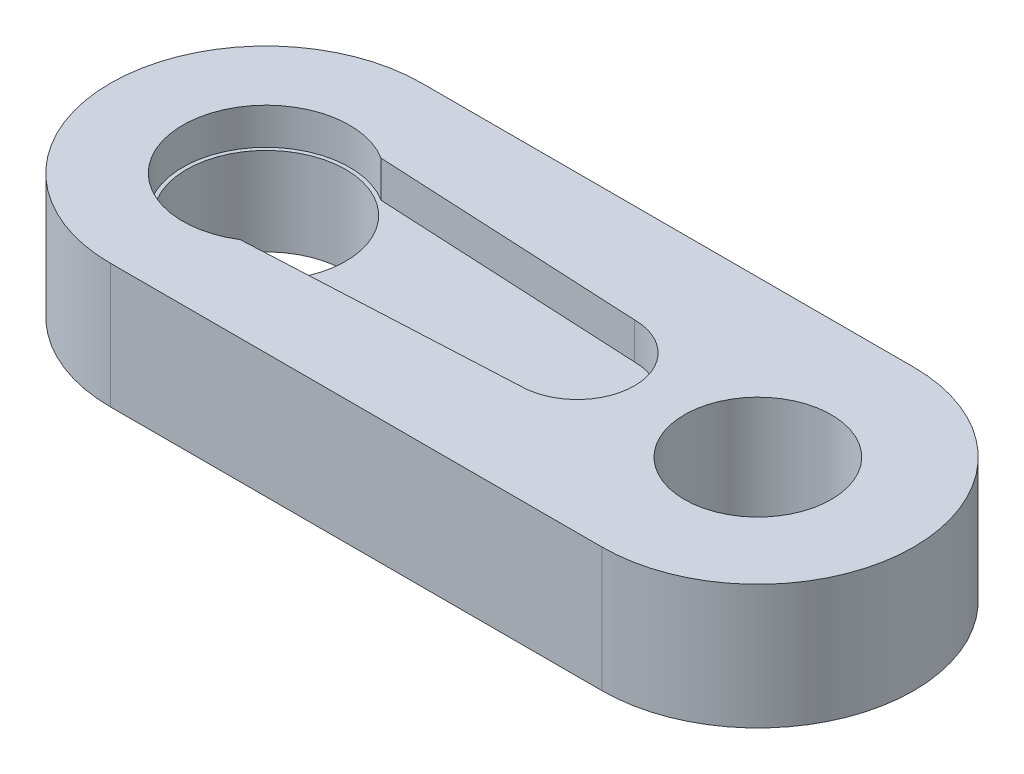
ISO-10303-21;
HEADER;
FILE_DESCRIPTION(('STEP AP214'),'2;1');
FILE_NAME('part.step','',(''),(''),'','','');
FILE_SCHEMA(('AUTOMOTIVE_DESIGN { 1 0 10303 214 1 1 1 1 }'));
ENDSEC;
DATA;
#1=APPLICATION_CONTEXT('core data for automotive mechanical design processes');
#2=APPLICATION_PROTOCOL_DEFINITION('international standard','automotive_design',2000,#1);
#3=PRODUCT_CONTEXT('',#1,'mechanical');
#4=PRODUCT('Part','Part','',(#3));
#5=PRODUCT_RELATED_PRODUCT_CATEGORY('part','',(#4));
#6=PRODUCT_DEFINITION_FORMATION('','',#4);
#7=PRODUCT_DEFINITION_CONTEXT('part definition',#1,'design');
#8=PRODUCT_DEFINITION('design','',#6,#7);
#9=PRODUCT_DEFINITION_SHAPE('','',#8);
#10=(LENGTH_UNIT() NAMED_UNIT(*) SI_UNIT(.MILLI.,.METRE.));
#11=(NAMED_UNIT(*) PLANE_ANGLE_UNIT() SI_UNIT($,.RADIAN.));
#12=(NAMED_UNIT(*) SI_UNIT($,.STERADIAN.) SOLID_ANGLE_UNIT());
#13=UNCERTAINTY_MEASURE_WITH_UNIT(LENGTH_MEASURE(1.E-05),#10,'distance_accuracy_value','');
#14=(GEOMETRIC_REPRESENTATION_CONTEXT(3) GLOBAL_UNCERTAINTY_ASSIGNED_CONTEXT((#13)) GLOBAL_UNIT_ASSIGNED_CONTEXT((#10,
#11,#12)) REPRESENTATION_CONTEXT('',''));
#15=CARTESIAN_POINT('',(0.,0.,0.));
#16=DIRECTION('',(0.,0.,1.));
#17=DIRECTION('',(1.,0.,0.));
#18=AXIS2_PLACEMENT_3D('',#15,#16,#17);
#19=CARTESIAN_POINT('',(0.,3.95,0.));
#20=DIRECTION('',(0.,1.,0.));
#21=DIRECTION('',(0.,0.,1.));
#22=AXIS2_PLACEMENT_3D('',#19,#20,#21);
#23=PLANE('',#22);
#24=CARTESIAN_POINT('',(0.,3.95,0.));
#25=DIRECTION('',(0.,-1.,0.));
#26=DIRECTION('',(0.,0.,-1.));
#27=AXIS2_PLACEMENT_3D('',#24,#25,#26);
#28=CIRCLE('',#27,3.575);
#29=CARTESIAN_POINT('',(0.,3.95,-3.575));
#30=VERTEX_POINT('',#29);
#31=EDGE_CURVE('E177',#30,#30,#28,.T.);
#32=ORIENTED_EDGE('',*,*,#31,.T.);
#33=EDGE_LOOP('',(#32));
#34=FACE_BOUND('',#33,.T.);
#35=DIRECTION('',(0.99875866941023,0.,-0.0498108449828537));
#36=VECTOR('',#35,1.);
#37=CARTESIAN_POINT('',(1.99792628223678,3.95,3.16754093434442));
#38=LINE('',#37,#36);
#39=CARTESIAN_POINT('',(1.99792628223678,3.95,3.16754093434442));
#40=VERTEX_POINT('',#39);
#41=CARTESIAN_POINT('',(13.9793089820932,3.95,2.5699963876771));
#42=VERTEX_POINT('',#41);
#43=EDGE_CURVE('E117',#40,#42,#38,.T.);
#44=ORIENTED_EDGE('',*,*,#43,.T.);
#45=CARTESIAN_POINT('',(13.975,3.95,0.));
#46=DIRECTION('',(0.,1.,0.));
#47=DIRECTION('',(0.,0.,1.));
#48=AXIS2_PLACEMENT_3D('',#45,#46,#47);
#49=CIRCLE('',#48,2.57);
#50=CARTESIAN_POINT('',(13.9793089820932,3.95,-2.5699963876771));
#51=VERTEX_POINT('',#50);
#52=EDGE_CURVE('E141',#42,#51,#49,.T.);
#53=ORIENTED_EDGE('',*,*,#52,.T.);
#54=DIRECTION('',(-0.99875866941023,0.,-0.0498108449828539));
#55=VECTOR('',#54,1.);
#56=CARTESIAN_POINT('',(13.9793089820932,3.95,-2.5699963876771));
#57=LINE('',#56,#55);
#58=CARTESIAN_POINT('',(1.99792628223678,3.95,-3.16754093434442));
#59=VERTEX_POINT('',#58);
#60=EDGE_CURVE('E123',#51,#59,#57,.T.);
#61=ORIENTED_EDGE('',*,*,#60,.T.);
#62=CARTESIAN_POINT('',(0.,3.95,0.));
#63=DIRECTION('',(0.,1.,0.));
#64=DIRECTION('',(0.,0.,-1.));
#65=AXIS2_PLACEMENT_3D('',#62,#63,#64);
#66=CIRCLE('',#65,3.745);
#67=EDGE_CURVE('E147',#59,#40,#66,.T.);
#68=ORIENTED_EDGE('',*,*,#67,.T.);
#69=EDGE_LOOP('',(#44,#53,#61,#68));
#70=FACE_BOUND('',#69,.T.);
#71=ADVANCED_FACE('F39',(#34,#70),#23,.T.);
#72=CARTESIAN_POINT('',(0.,3.95,0.));
#73=DIRECTION('',(0.,-1.,0.));
#74=DIRECTION('',(0.,0.,-1.));
#75=AXIS2_PLACEMENT_3D('',#72,#73,#74);
#76=CYLINDRICAL_SURFACE('',#75,7.);
#77=CARTESIAN_POINT('',(0.,0.,0.));
#78=DIRECTION('',(0.,1.,0.));
#79=DIRECTION('',(0.,0.,1.));
#80=AXIS2_PLACEMENT_3D('',#77,#78,#79);
#81=CIRCLE('',#80,7.);
#82=CARTESIAN_POINT('',(0.,0.,-7.));
#83=VERTEX_POINT('',#82);
#84=CARTESIAN_POINT('',(0.,0.,7.));
#85=VERTEX_POINT('',#84);
#86=EDGE_CURVE('E181',#83,#85,#81,.T.);
#87=ORIENTED_EDGE('',*,*,#86,.T.);
#88=DIRECTION('',(0.,-1.,0.));
#89=VECTOR('',#88,1.);
#90=CARTESIAN_POINT('',(0.,3.95,7.));
#91=LINE('',#90,#89);
#92=CARTESIAN_POINT('',(0.,5.59,7.));
#93=VERTEX_POINT('',#92);
#94=EDGE_CURVE('E11',#93,#85,#91,.T.);
#95=ORIENTED_EDGE('',*,*,#94,.F.);
#96=CARTESIAN_POINT('',(0.,5.59,0.));
#97=DIRECTION('',(0.,1.,0.));
#98=DIRECTION('',(0.,0.,1.));
#99=AXIS2_PLACEMENT_3D('',#96,#97,#98);
#100=CIRCLE('',#99,7.);
#101=CARTESIAN_POINT('',(0.,5.59,-7.));
#102=VERTEX_POINT('',#101);
#103=EDGE_CURVE('E125',#102,#93,#100,.T.);
#104=ORIENTED_EDGE('',*,*,#103,.F.);
#105=DIRECTION('',(0.,-1.,0.));
#106=VECTOR('',#105,1.);
#107=CARTESIAN_POINT('',(0.,3.95,-7.));
#108=LINE('',#107,#106);
#109=EDGE_CURVE('E196',#102,#83,#108,.T.);
#110=ORIENTED_EDGE('',*,*,#109,.T.);
#111=EDGE_LOOP('',(#87,#95,#104,#110));
#112=FACE_BOUND('',#111,.T.);
#113=ADVANCED_FACE('F41',(#112),#76,.T.);
#114=CARTESIAN_POINT('',(0.,3.95,7.));
#115=DIRECTION('',(0.,0.,-1.));
#116=DIRECTION('',(-1.,0.,0.));
#117=AXIS2_PLACEMENT_3D('',#114,#115,#116);
#118=PLANE('',#117);
#119=DIRECTION('',(1.,0.,0.));
#120=VECTOR('',#119,1.);
#121=CARTESIAN_POINT('',(0.,0.,7.));
#122=LINE('',#121,#120);
#123=CARTESIAN_POINT('',(22.0896226415094,0.,7.));
#124=VERTEX_POINT('',#123);
#125=EDGE_CURVE('E188',#85,#124,#122,.T.);
#126=ORIENTED_EDGE('',*,*,#125,.T.);
#127=DIRECTION('',(0.,-1.,0.));
#128=VECTOR('',#127,1.);
#129=CARTESIAN_POINT('',(22.0896226415094,3.95,7.));
#130=LINE('',#129,#128);
#131=CARTESIAN_POINT('',(22.0896226415094,5.59,7.));
#132=VERTEX_POINT('',#131);
#133=EDGE_CURVE('E48',#132,#124,#130,.T.);
#134=ORIENTED_EDGE('',*,*,#133,.F.);
#135=DIRECTION('',(1.,0.,0.));
#136=VECTOR('',#135,1.);
#137=CARTESIAN_POINT('',(0.,5.59,7.));
#138=LINE('',#137,#136);
#139=EDGE_CURVE('E164',#93,#132,#138,.T.);
#140=ORIENTED_EDGE('',*,*,#139,.F.);
#141=ORIENTED_EDGE('',*,*,#94,.T.);
#142=EDGE_LOOP('',(#126,#134,#140,#141));
#143=FACE_BOUND('',#142,.T.);
#144=ADVANCED_FACE('F217',(#143),#118,.F.);
#145=CARTESIAN_POINT('',(22.0896226415094,3.95,0.));
#146=DIRECTION('',(0.,-1.,0.));
#147=DIRECTION('',(0.,0.,-1.));
#148=AXIS2_PLACEMENT_3D('',#145,#146,#147);
#149=CYLINDRICAL_SURFACE('',#148,7.);
#150=CARTESIAN_POINT('',(22.0896226415094,0.,0.));
#151=DIRECTION('',(0.,1.,0.));
#152=DIRECTION('',(0.,0.,1.));
#153=AXIS2_PLACEMENT_3D('',#150,#151,#152);
#154=CIRCLE('',#153,7.);
#155=CARTESIAN_POINT('',(22.0896226415094,0.,-7.));
#156=VERTEX_POINT('',#155);
#157=EDGE_CURVE('E191',#124,#156,#154,.T.);
#158=ORIENTED_EDGE('',*,*,#157,.T.);
#159=DIRECTION('',(0.,-1.,0.));
#160=VECTOR('',#159,1.);
#161=CARTESIAN_POINT('',(22.0896226415094,3.95,-7.));
#162=LINE('',#161,#160);
#163=CARTESIAN_POINT('',(22.0896226415094,5.59,-7.));
#164=VERTEX_POINT('',#163);
#165=EDGE_CURVE('E199',#164,#156,#162,.T.);
#166=ORIENTED_EDGE('',*,*,#165,.F.);
#167=CARTESIAN_POINT('',(22.0896226415094,5.59,0.));
#168=DIRECTION('',(0.,1.,0.));
#169=DIRECTION('',(0.,0.,1.));
#170=AXIS2_PLACEMENT_3D('',#167,#168,#169);
#171=CIRCLE('',#170,7.);
#172=EDGE_CURVE('E168',#132,#164,#171,.T.);
#173=ORIENTED_EDGE('',*,*,#172,.F.);
#174=ORIENTED_EDGE('',*,*,#133,.T.);
#175=EDGE_LOOP('',(#158,#166,#173,#174));
#176=FACE_BOUND('',#175,.T.);
#177=ADVANCED_FACE('F206',(#176),#149,.T.);
#178=CARTESIAN_POINT('',(0.,3.95,-7.));
#179=DIRECTION('',(0.,0.,1.));
#180=DIRECTION('',(1.,0.,0.));
#181=AXIS2_PLACEMENT_3D('',#178,#179,#180);
#182=PLANE('',#181);
#183=DIRECTION('',(-1.,0.,0.));
#184=VECTOR('',#183,1.);
#185=CARTESIAN_POINT('',(0.,0.,-7.));
#186=LINE('',#185,#184);
#187=EDGE_CURVE('E63',#156,#83,#186,.T.);
#188=ORIENTED_EDGE('',*,*,#187,.T.);
#189=ORIENTED_EDGE('',*,*,#109,.F.);
#190=DIRECTION('',(-1.,0.,0.));
#191=VECTOR('',#190,1.);
#192=CARTESIAN_POINT('',(22.0896226415094,5.59,-7.));
#193=LINE('',#192,#191);
#194=EDGE_CURVE('E172',#164,#102,#193,.T.);
#195=ORIENTED_EDGE('',*,*,#194,.F.);
#196=ORIENTED_EDGE('',*,*,#165,.T.);
#197=EDGE_LOOP('',(#188,#189,#195,#196));
#198=FACE_BOUND('',#197,.T.);
#199=ADVANCED_FACE('F215',(#198),#182,.F.);
#200=CARTESIAN_POINT('',(0.,0.,0.));
#201=DIRECTION('',(0.,1.,0.));
#202=DIRECTION('',(0.,0.,1.));
#203=AXIS2_PLACEMENT_3D('',#200,#201,#202);
#204=PLANE('',#203);
#205=CARTESIAN_POINT('',(22.0896226415094,0.,0.));
#206=DIRECTION('',(0.,1.,0.));
#207=DIRECTION('',(0.,0.,1.));
#208=AXIS2_PLACEMENT_3D('',#205,#206,#207);
#209=CIRCLE('',#208,3.3);
#210=CARTESIAN_POINT('',(22.0896226415094,0.,3.3));
#211=VERTEX_POINT('',#210);
#212=EDGE_CURVE('E144',#211,#211,#209,.T.);
#213=ORIENTED_EDGE('',*,*,#212,.T.);
#214=EDGE_LOOP('',(#213));
#215=FACE_BOUND('',#214,.T.);
#216=CARTESIAN_POINT('',(0.,0.,0.));
#217=DIRECTION('',(0.,-1.,0.));
#218=DIRECTION('',(0.,0.,-1.));
#219=AXIS2_PLACEMENT_3D('',#216,#217,#218);
#220=CIRCLE('',#219,3.575);
#221=CARTESIAN_POINT('',(0.,0.,-3.575));
#222=VERTEX_POINT('',#221);
#223=EDGE_CURVE('E176',#222,#222,#220,.T.);
#224=ORIENTED_EDGE('',*,*,#223,.F.);
#225=EDGE_LOOP('',(#224));
#226=FACE_BOUND('',#225,.T.);
#227=ORIENTED_EDGE('',*,*,#86,.F.);
#228=ORIENTED_EDGE('',*,*,#187,.F.);
#229=ORIENTED_EDGE('',*,*,#157,.F.);
#230=ORIENTED_EDGE('',*,*,#125,.F.);
#231=EDGE_LOOP('',(#227,#228,#229,#230));
#232=FACE_BOUND('',#231,.T.);
#233=ADVANCED_FACE('F211',(#215,#226,#232),#204,.F.);
#234=CARTESIAN_POINT('',(0.,3.95,0.));
#235=DIRECTION('',(0.,-1.,0.));
#236=DIRECTION('',(0.,0.,-1.));
#237=AXIS2_PLACEMENT_3D('',#234,#235,#236);
#238=CYLINDRICAL_SURFACE('',#237,3.575);
#239=ORIENTED_EDGE('',*,*,#31,.F.);
#240=EDGE_LOOP('',(#239));
#241=FACE_BOUND('',#240,.T.);
#242=ORIENTED_EDGE('',*,*,#223,.T.);
#243=EDGE_LOOP('',(#242));
#244=FACE_BOUND('',#243,.T.);
#245=ADVANCED_FACE('F232',(#241,#244),#238,.F.);
#246=CARTESIAN_POINT('',(0.,5.59,0.));
#247=DIRECTION('',(0.,1.,0.));
#248=DIRECTION('',(0.,0.,1.));
#249=AXIS2_PLACEMENT_3D('',#246,#247,#248);
#250=PLANE('',#249);
#251=CARTESIAN_POINT('',(22.0896226415094,5.59,0.));
#252=DIRECTION('',(0.,1.,0.));
#253=DIRECTION('',(0.,0.,1.));
#254=AXIS2_PLACEMENT_3D('',#251,#252,#253);
#255=CIRCLE('',#254,3.3);
#256=CARTESIAN_POINT('',(22.0896226415094,5.59,3.3));
#257=VERTEX_POINT('',#256);
#258=EDGE_CURVE('E348',#257,#257,#255,.T.);
#259=ORIENTED_EDGE('',*,*,#258,.F.);
#260=EDGE_LOOP('',(#259));
#261=FACE_BOUND('',#260,.T.);
#262=ORIENTED_EDGE('',*,*,#103,.T.);
#263=ORIENTED_EDGE('',*,*,#139,.T.);
#264=ORIENTED_EDGE('',*,*,#172,.T.);
#265=ORIENTED_EDGE('',*,*,#194,.T.);
#266=EDGE_LOOP('',(#262,#263,#264,#265));
#267=FACE_BOUND('',#266,.T.);
#268=DIRECTION('',(-0.99875866941023,0.,-0.0498108449828539));
#269=VECTOR('',#268,1.);
#270=CARTESIAN_POINT('',(13.9793089820932,5.59,-2.5699963876771));
#271=LINE('',#270,#269);
#272=CARTESIAN_POINT('',(13.9793089820932,5.59,-2.5699963876771));
#273=VERTEX_POINT('',#272);
#274=CARTESIAN_POINT('',(1.99792628223678,5.59,-3.16754093434442));
#275=VERTEX_POINT('',#274);
#276=EDGE_CURVE('E116',#273,#275,#271,.T.);
#277=ORIENTED_EDGE('',*,*,#276,.F.);
#278=CARTESIAN_POINT('',(13.975,5.59,0.));
#279=DIRECTION('',(0.,1.,0.));
#280=DIRECTION('',(0.,0.,1.));
#281=AXIS2_PLACEMENT_3D('',#278,#279,#280);
#282=CIRCLE('',#281,2.57);
#283=CARTESIAN_POINT('',(13.9793089820932,5.59,2.5699963876771));
#284=VERTEX_POINT('',#283);
#285=EDGE_CURVE('E107',#284,#273,#282,.T.);
#286=ORIENTED_EDGE('',*,*,#285,.F.);
#287=DIRECTION('',(0.99875866941023,0.,-0.0498108449828537));
#288=VECTOR('',#287,1.);
#289=CARTESIAN_POINT('',(1.99792628223678,5.59,3.16754093434442));
#290=LINE('',#289,#288);
#291=CARTESIAN_POINT('',(1.99792628223678,5.59,3.16754093434442));
#292=VERTEX_POINT('',#291);
#293=EDGE_CURVE('E135',#292,#284,#290,.T.);
#294=ORIENTED_EDGE('',*,*,#293,.F.);
#295=CARTESIAN_POINT('',(0.,5.59,0.));
#296=DIRECTION('',(0.,1.,0.));
#297=DIRECTION('',(0.,0.,-1.));
#298=AXIS2_PLACEMENT_3D('',#295,#296,#297);
#299=CIRCLE('',#298,3.745);
#300=EDGE_CURVE('E131',#275,#292,#299,.T.);
#301=ORIENTED_EDGE('',*,*,#300,.F.);
#302=EDGE_LOOP('',(#277,#286,#294,#301));
#303=FACE_BOUND('',#302,.T.);
#304=ADVANCED_FACE('F129',(#261,#267,#303),#250,.T.);
#305=CARTESIAN_POINT('',(13.975,5.59,0.));
#306=DIRECTION('',(0.,-1.,0.));
#307=DIRECTION('',(0.,0.,-1.));
#308=AXIS2_PLACEMENT_3D('',#305,#306,#307);
#309=CYLINDRICAL_SURFACE('',#308,2.57);
#310=ORIENTED_EDGE('',*,*,#52,.F.);
#311=DIRECTION('',(0.,-1.,0.));
#312=VECTOR('',#311,1.);
#313=CARTESIAN_POINT('',(13.9793089820932,5.59,2.5699963876771));
#314=LINE('',#313,#312);
#315=EDGE_CURVE('E55',#284,#42,#314,.T.);
#316=ORIENTED_EDGE('',*,*,#315,.F.);
#317=ORIENTED_EDGE('',*,*,#285,.T.);
#318=DIRECTION('',(0.,-1.,0.));
#319=VECTOR('',#318,1.);
#320=CARTESIAN_POINT('',(13.9793089820932,5.59,-2.5699963876771));
#321=LINE('',#320,#319);
#322=EDGE_CURVE('E110',#273,#51,#321,.T.);
#323=ORIENTED_EDGE('',*,*,#322,.T.);
#324=EDGE_LOOP('',(#310,#316,#317,#323));
#325=FACE_BOUND('',#324,.T.);
#326=ADVANCED_FACE('F109',(#325),#309,.F.);
#327=CARTESIAN_POINT('',(13.9793089820932,5.59,-2.5699963876771));
#328=DIRECTION('',(-0.0498108449828539,0.,0.99875866941023));
#329=DIRECTION('',(0.998758669410231,0.,0.0498108449828539));
#330=AXIS2_PLACEMENT_3D('',#327,#328,#329);
#331=PLANE('',#330);
#332=ORIENTED_EDGE('',*,*,#60,.F.);
#333=ORIENTED_EDGE('',*,*,#322,.F.);
#334=ORIENTED_EDGE('',*,*,#276,.T.);
#335=DIRECTION('',(0.,-1.,0.));
#336=VECTOR('',#335,1.);
#337=CARTESIAN_POINT('',(1.99792628223678,5.59,-3.16754093434442));
#338=LINE('',#337,#336);
#339=EDGE_CURVE('E126',#275,#59,#338,.T.);
#340=ORIENTED_EDGE('',*,*,#339,.T.);
#341=EDGE_LOOP('',(#332,#333,#334,#340));
#342=FACE_BOUND('',#341,.T.);
#343=ADVANCED_FACE('F120',(#342),#331,.T.);
#344=CARTESIAN_POINT('',(0.,5.59,0.));
#345=DIRECTION('',(0.,-1.,0.));
#346=DIRECTION('',(0.,0.,-1.));
#347=AXIS2_PLACEMENT_3D('',#344,#345,#346);
#348=CYLINDRICAL_SURFACE('',#347,3.745);
#349=ORIENTED_EDGE('',*,*,#67,.F.);
#350=ORIENTED_EDGE('',*,*,#339,.F.);
#351=ORIENTED_EDGE('',*,*,#300,.T.);
#352=DIRECTION('',(0.,-1.,0.));
#353=VECTOR('',#352,1.);
#354=CARTESIAN_POINT('',(1.99792628223678,5.59,3.16754093434442));
#355=LINE('',#354,#353);
#356=EDGE_CURVE('E156',#292,#40,#355,.T.);
#357=ORIENTED_EDGE('',*,*,#356,.T.);
#358=EDGE_LOOP('',(#349,#350,#351,#357));
#359=FACE_BOUND('',#358,.T.);
#360=ADVANCED_FACE('F272',(#359),#348,.F.);
#361=CARTESIAN_POINT('',(1.99792628223678,5.59,3.16754093434442));
#362=DIRECTION('',(-0.0498108449828537,0.,-0.99875866941023));
#363=DIRECTION('',(-0.998758669410231,0.,0.0498108449828537));
#364=AXIS2_PLACEMENT_3D('',#361,#362,#363);
#365=PLANE('',#364);
#366=ORIENTED_EDGE('',*,*,#43,.F.);
#367=ORIENTED_EDGE('',*,*,#356,.F.);
#368=ORIENTED_EDGE('',*,*,#293,.T.);
#369=ORIENTED_EDGE('',*,*,#315,.T.);
#370=EDGE_LOOP('',(#366,#367,#368,#369));
#371=FACE_BOUND('',#370,.T.);
#372=ADVANCED_FACE('F279',(#371),#365,.T.);
#373=CARTESIAN_POINT('',(22.0896226415094,0.,0.));
#374=DIRECTION('',(0.,1.,0.));
#375=DIRECTION('',(0.,0.,1.));
#376=AXIS2_PLACEMENT_3D('',#373,#374,#375);
#377=CYLINDRICAL_SURFACE('',#376,3.3);
#378=ORIENTED_EDGE('',*,*,#212,.F.);
#379=EDGE_LOOP('',(#378));
#380=FACE_BOUND('',#379,.T.);
#381=ORIENTED_EDGE('',*,*,#258,.T.);
#382=EDGE_LOOP('',(#381));
#383=FACE_BOUND('',#382,.T.);
#384=ADVANCED_FACE('F286',(#380,#383),#377,.F.);
#385=CLOSED_SHELL('',(#71,#113,#144,#177,#199,#233,#245,#304,#326,#343,#360,#372,#384));
#386=MANIFOLD_SOLID_BREP('B2',#385);
#387=ADVANCED_BREP_SHAPE_REPRESENTATION('',(#18,#386),#14);
#388=SHAPE_DEFINITION_REPRESENTATION(#9,#387);
ENDSEC;
END-ISO-10303-21;
